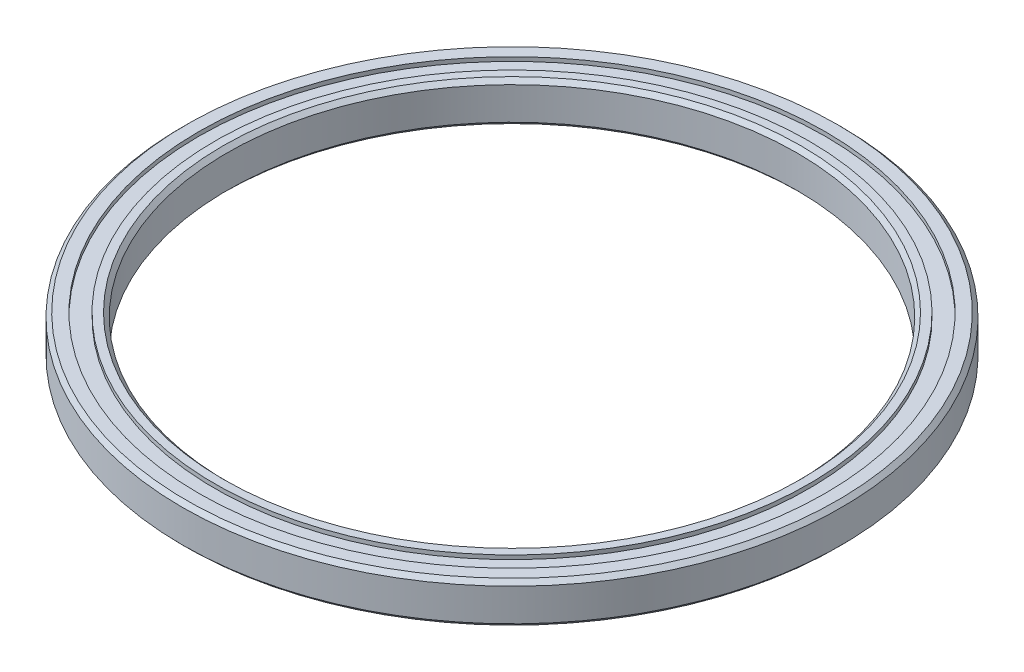
ISO-10303-21;
HEADER;
FILE_DESCRIPTION(('STEP AP214'),'2;1');
FILE_NAME('part.step','',(''),(''),'','','');
FILE_SCHEMA(('AUTOMOTIVE_DESIGN { 1 0 10303 214 1 1 1 1 }'));
ENDSEC;
DATA;
#1=APPLICATION_CONTEXT('core data for automotive mechanical design processes');
#2=APPLICATION_PROTOCOL_DEFINITION('international standard','automotive_design',2000,#1);
#3=PRODUCT_CONTEXT('',#1,'mechanical');
#4=PRODUCT('Part','Part','',(#3));
#5=PRODUCT_RELATED_PRODUCT_CATEGORY('part','',(#4));
#6=PRODUCT_DEFINITION_FORMATION('','',#4);
#7=PRODUCT_DEFINITION_CONTEXT('part definition',#1,'design');
#8=PRODUCT_DEFINITION('design','',#6,#7);
#9=PRODUCT_DEFINITION_SHAPE('','',#8);
#10=(LENGTH_UNIT() NAMED_UNIT(*) SI_UNIT(.MILLI.,.METRE.));
#11=(NAMED_UNIT(*) PLANE_ANGLE_UNIT() SI_UNIT($,.RADIAN.));
#12=(NAMED_UNIT(*) SI_UNIT($,.STERADIAN.) SOLID_ANGLE_UNIT());
#13=UNCERTAINTY_MEASURE_WITH_UNIT(LENGTH_MEASURE(1.E-05),#10,'distance_accuracy_value','');
#14=(GEOMETRIC_REPRESENTATION_CONTEXT(3) GLOBAL_UNCERTAINTY_ASSIGNED_CONTEXT((#13)) GLOBAL_UNIT_ASSIGNED_CONTEXT((#10,
#11,#12)) REPRESENTATION_CONTEXT('',''));
#15=CARTESIAN_POINT('',(0.,0.,0.));
#16=DIRECTION('',(0.,0.,1.));
#17=DIRECTION('',(1.,0.,0.));
#18=AXIS2_PLACEMENT_3D('',#15,#16,#17);
#19=CARTESIAN_POINT('',(0.,0.,0.));
#20=DIRECTION('',(0.,-1.,0.));
#21=DIRECTION('',(0.,0.,-1.));
#22=AXIS2_PLACEMENT_3D('',#19,#20,#21);
#23=CYLINDRICAL_SURFACE('',#22,38.5);
#24=CARTESIAN_POINT('',(0.,5.,0.));
#25=DIRECTION('',(0.,-1.,0.));
#26=DIRECTION('',(0.,0.,-1.));
#27=AXIS2_PLACEMENT_3D('',#24,#25,#26);
#28=CIRCLE('',#27,38.5);
#29=CARTESIAN_POINT('',(0.,5.,-38.5));
#30=VERTEX_POINT('',#29);
#31=EDGE_CURVE('E10',#30,#30,#28,.T.);
#32=ORIENTED_EDGE('',*,*,#31,.F.);
#33=EDGE_LOOP('',(#32));
#34=FACE_BOUND('',#33,.T.);
#35=CARTESIAN_POINT('',(0.,4.5,0.));
#36=DIRECTION('',(0.,-1.,0.));
#37=DIRECTION('',(0.,0.,-1.));
#38=AXIS2_PLACEMENT_3D('',#35,#36,#37);
#39=CIRCLE('',#38,38.5);
#40=CARTESIAN_POINT('',(0.,4.5,-38.5));
#41=VERTEX_POINT('',#40);
#42=EDGE_CURVE('E91',#41,#41,#39,.T.);
#43=ORIENTED_EDGE('',*,*,#42,.T.);
#44=EDGE_LOOP('',(#43));
#45=FACE_BOUND('',#44,.T.);
#46=ADVANCED_FACE('F39',(#34,#45),#23,.F.);
#47=CARTESIAN_POINT('',(-40.,5.,0.));
#48=DIRECTION('',(0.,-1.,0.));
#49=DIRECTION('',(0.,0.,-1.));
#50=AXIS2_PLACEMENT_3D('',#47,#48,#49);
#51=PLANE('',#50);
#52=CARTESIAN_POINT('',(0.,5.,0.));
#53=DIRECTION('',(0.,-1.,0.));
#54=DIRECTION('',(0.,0.,-1.));
#55=AXIS2_PLACEMENT_3D('',#52,#53,#54);
#56=CIRCLE('',#55,40.);
#57=CARTESIAN_POINT('',(0.,5.,-40.));
#58=VERTEX_POINT('',#57);
#59=EDGE_CURVE('E45',#58,#58,#56,.T.);
#60=ORIENTED_EDGE('',*,*,#59,.F.);
#61=EDGE_LOOP('',(#60));
#62=FACE_BOUND('',#61,.T.);
#63=ORIENTED_EDGE('',*,*,#31,.T.);
#64=EDGE_LOOP('',(#63));
#65=FACE_BOUND('',#64,.T.);
#66=ADVANCED_FACE('F176',(#62,#65),#51,.F.);
#67=CARTESIAN_POINT('',(0.,5.,0.));
#68=DIRECTION('',(0.,-1.,0.));
#69=DIRECTION('',(0.,0.,-1.));
#70=AXIS2_PLACEMENT_3D('',#67,#68,#69);
#71=CONICAL_SURFACE('',#70,40.,0.785398163397449);
#72=CARTESIAN_POINT('',(0.,4.5,0.));
#73=DIRECTION('',(0.,-1.,0.));
#74=DIRECTION('',(0.,0.,-1.));
#75=AXIS2_PLACEMENT_3D('',#72,#73,#74);
#76=CIRCLE('',#75,40.5);
#77=CARTESIAN_POINT('',(0.,4.5,-40.5));
#78=VERTEX_POINT('',#77);
#79=EDGE_CURVE('E49',#78,#78,#76,.T.);
#80=ORIENTED_EDGE('',*,*,#79,.F.);
#81=EDGE_LOOP('',(#80));
#82=FACE_BOUND('',#81,.T.);
#83=ORIENTED_EDGE('',*,*,#59,.T.);
#84=EDGE_LOOP('',(#83));
#85=FACE_BOUND('',#84,.T.);
#86=ADVANCED_FACE('F171',(#82,#85),#71,.T.);
#87=CARTESIAN_POINT('',(0.,0.,0.));
#88=DIRECTION('',(0.,-1.,0.));
#89=DIRECTION('',(0.,0.,-1.));
#90=AXIS2_PLACEMENT_3D('',#87,#88,#89);
#91=CYLINDRICAL_SURFACE('',#90,40.5);
#92=CARTESIAN_POINT('',(0.,0.499999999999999,0.));
#93=DIRECTION('',(0.,-1.,0.));
#94=DIRECTION('',(0.,0.,-1.));
#95=AXIS2_PLACEMENT_3D('',#92,#93,#94);
#96=CIRCLE('',#95,40.5);
#97=CARTESIAN_POINT('',(0.,0.499999999999999,-40.5));
#98=VERTEX_POINT('',#97);
#99=EDGE_CURVE('E53',#98,#98,#96,.T.);
#100=ORIENTED_EDGE('',*,*,#99,.F.);
#101=EDGE_LOOP('',(#100));
#102=FACE_BOUND('',#101,.T.);
#103=ORIENTED_EDGE('',*,*,#79,.T.);
#104=EDGE_LOOP('',(#103));
#105=FACE_BOUND('',#104,.T.);
#106=ADVANCED_FACE('F165',(#102,#105),#91,.T.);
#107=CARTESIAN_POINT('',(0.,0.499999999999999,0.));
#108=DIRECTION('',(0.,1.,0.));
#109=DIRECTION('',(0.,0.,1.));
#110=AXIS2_PLACEMENT_3D('',#107,#108,#109);
#111=CONICAL_SURFACE('',#110,40.5,0.785398163397449);
#112=CARTESIAN_POINT('',(0.,0.,0.));
#113=DIRECTION('',(0.,-1.,0.));
#114=DIRECTION('',(0.,0.,-1.));
#115=AXIS2_PLACEMENT_3D('',#112,#113,#114);
#116=CIRCLE('',#115,40.);
#117=CARTESIAN_POINT('',(0.,0.,-40.));
#118=VERTEX_POINT('',#117);
#119=EDGE_CURVE('E58',#118,#118,#116,.T.);
#120=ORIENTED_EDGE('',*,*,#119,.F.);
#121=EDGE_LOOP('',(#120));
#122=FACE_BOUND('',#121,.T.);
#123=ORIENTED_EDGE('',*,*,#99,.T.);
#124=EDGE_LOOP('',(#123));
#125=FACE_BOUND('',#124,.T.);
#126=ADVANCED_FACE('F159',(#122,#125),#111,.T.);
#127=CARTESIAN_POINT('',(-38.5,0.,0.));
#128=DIRECTION('',(0.,1.,0.));
#129=DIRECTION('',(0.,0.,1.));
#130=AXIS2_PLACEMENT_3D('',#127,#128,#129);
#131=PLANE('',#130);
#132=CARTESIAN_POINT('',(0.,0.,0.));
#133=DIRECTION('',(0.,-1.,0.));
#134=DIRECTION('',(0.,0.,-1.));
#135=AXIS2_PLACEMENT_3D('',#132,#133,#134);
#136=CIRCLE('',#135,38.5);
#137=CARTESIAN_POINT('',(0.,0.,-38.5));
#138=VERTEX_POINT('',#137);
#139=EDGE_CURVE('E61',#138,#138,#136,.T.);
#140=ORIENTED_EDGE('',*,*,#139,.F.);
#141=EDGE_LOOP('',(#140));
#142=FACE_BOUND('',#141,.T.);
#143=ORIENTED_EDGE('',*,*,#119,.T.);
#144=EDGE_LOOP('',(#143));
#145=FACE_BOUND('',#144,.T.);
#146=ADVANCED_FACE('F153',(#142,#145),#131,.F.);
#147=CARTESIAN_POINT('',(0.,0.,0.));
#148=DIRECTION('',(0.,-1.,0.));
#149=DIRECTION('',(0.,0.,-1.));
#150=AXIS2_PLACEMENT_3D('',#147,#148,#149);
#151=CYLINDRICAL_SURFACE('',#150,38.5);
#152=CARTESIAN_POINT('',(0.,0.499999999999995,0.));
#153=DIRECTION('',(0.,-1.,0.));
#154=DIRECTION('',(0.,0.,-1.));
#155=AXIS2_PLACEMENT_3D('',#152,#153,#154);
#156=CIRCLE('',#155,38.5);
#157=CARTESIAN_POINT('',(0.,0.499999999999995,-38.5));
#158=VERTEX_POINT('',#157);
#159=EDGE_CURVE('E64',#158,#158,#156,.T.);
#160=ORIENTED_EDGE('',*,*,#159,.F.);
#161=EDGE_LOOP('',(#160));
#162=FACE_BOUND('',#161,.T.);
#163=ORIENTED_EDGE('',*,*,#139,.T.);
#164=EDGE_LOOP('',(#163));
#165=FACE_BOUND('',#164,.T.);
#166=ADVANCED_FACE('F147',(#162,#165),#151,.F.);
#167=CARTESIAN_POINT('',(-38.5,0.499999999999995,0.));
#168=DIRECTION('',(0.,1.,0.));
#169=DIRECTION('',(0.,0.,1.));
#170=AXIS2_PLACEMENT_3D('',#167,#168,#169);
#171=PLANE('',#170);
#172=CARTESIAN_POINT('',(0.,0.499999999999995,0.));
#173=DIRECTION('',(0.,-1.,0.));
#174=DIRECTION('',(0.,0.,-1.));
#175=AXIS2_PLACEMENT_3D('',#172,#173,#174);
#176=CIRCLE('',#175,36.5);
#177=CARTESIAN_POINT('',(0.,0.499999999999995,-36.5));
#178=VERTEX_POINT('',#177);
#179=EDGE_CURVE('E67',#178,#178,#176,.T.);
#180=ORIENTED_EDGE('',*,*,#179,.F.);
#181=EDGE_LOOP('',(#180));
#182=FACE_BOUND('',#181,.T.);
#183=ORIENTED_EDGE('',*,*,#159,.T.);
#184=EDGE_LOOP('',(#183));
#185=FACE_BOUND('',#184,.T.);
#186=ADVANCED_FACE('F141',(#182,#185),#171,.F.);
#187=CARTESIAN_POINT('',(0.,0.,0.));
#188=DIRECTION('',(0.,-1.,0.));
#189=DIRECTION('',(0.,0.,-1.));
#190=AXIS2_PLACEMENT_3D('',#187,#188,#189);
#191=CYLINDRICAL_SURFACE('',#190,36.5);
#192=CARTESIAN_POINT('',(0.,0.,0.));
#193=DIRECTION('',(0.,-1.,0.));
#194=DIRECTION('',(0.,0.,-1.));
#195=AXIS2_PLACEMENT_3D('',#192,#193,#194);
#196=CIRCLE('',#195,36.5);
#197=CARTESIAN_POINT('',(0.,0.,-36.5));
#198=VERTEX_POINT('',#197);
#199=EDGE_CURVE('E70',#198,#198,#196,.T.);
#200=ORIENTED_EDGE('',*,*,#199,.F.);
#201=EDGE_LOOP('',(#200));
#202=FACE_BOUND('',#201,.T.);
#203=ORIENTED_EDGE('',*,*,#179,.T.);
#204=EDGE_LOOP('',(#203));
#205=FACE_BOUND('',#204,.T.);
#206=ADVANCED_FACE('F135',(#202,#205),#191,.T.);
#207=CARTESIAN_POINT('',(-35.5,0.,0.));
#208=DIRECTION('',(0.,1.,0.));
#209=DIRECTION('',(0.,0.,1.));
#210=AXIS2_PLACEMENT_3D('',#207,#208,#209);
#211=PLANE('',#210);
#212=CARTESIAN_POINT('',(0.,0.,0.));
#213=DIRECTION('',(0.,-1.,0.));
#214=DIRECTION('',(0.,0.,-1.));
#215=AXIS2_PLACEMENT_3D('',#212,#213,#214);
#216=CIRCLE('',#215,35.5);
#217=CARTESIAN_POINT('',(0.,0.,-35.5));
#218=VERTEX_POINT('',#217);
#219=EDGE_CURVE('E73',#218,#218,#216,.T.);
#220=ORIENTED_EDGE('',*,*,#219,.F.);
#221=EDGE_LOOP('',(#220));
#222=FACE_BOUND('',#221,.T.);
#223=ORIENTED_EDGE('',*,*,#199,.T.);
#224=EDGE_LOOP('',(#223));
#225=FACE_BOUND('',#224,.T.);
#226=ADVANCED_FACE('F129',(#222,#225),#211,.F.);
#227=CARTESIAN_POINT('',(0.,0.,0.));
#228=DIRECTION('',(0.,-1.,0.));
#229=DIRECTION('',(0.,0.,-1.));
#230=AXIS2_PLACEMENT_3D('',#227,#228,#229);
#231=CONICAL_SURFACE('',#230,35.5,0.785398163397452);
#232=CARTESIAN_POINT('',(0.,0.499999999999998,0.));
#233=DIRECTION('',(0.,-1.,0.));
#234=DIRECTION('',(0.,0.,-1.));
#235=AXIS2_PLACEMENT_3D('',#232,#233,#234);
#236=CIRCLE('',#235,35.);
#237=CARTESIAN_POINT('',(0.,0.499999999999998,-35.));
#238=VERTEX_POINT('',#237);
#239=EDGE_CURVE('E76',#238,#238,#236,.T.);
#240=ORIENTED_EDGE('',*,*,#239,.F.);
#241=EDGE_LOOP('',(#240));
#242=FACE_BOUND('',#241,.T.);
#243=ORIENTED_EDGE('',*,*,#219,.T.);
#244=EDGE_LOOP('',(#243));
#245=FACE_BOUND('',#244,.T.);
#246=ADVANCED_FACE('F123',(#242,#245),#231,.F.);
#247=CARTESIAN_POINT('',(0.,0.,0.));
#248=DIRECTION('',(0.,-1.,0.));
#249=DIRECTION('',(0.,0.,-1.));
#250=AXIS2_PLACEMENT_3D('',#247,#248,#249);
#251=CYLINDRICAL_SURFACE('',#250,35.);
#252=CARTESIAN_POINT('',(0.,4.5,0.));
#253=DIRECTION('',(0.,-1.,0.));
#254=DIRECTION('',(0.,0.,-1.));
#255=AXIS2_PLACEMENT_3D('',#252,#253,#254);
#256=CIRCLE('',#255,35.);
#257=CARTESIAN_POINT('',(0.,4.5,-35.));
#258=VERTEX_POINT('',#257);
#259=EDGE_CURVE('E79',#258,#258,#256,.T.);
#260=ORIENTED_EDGE('',*,*,#259,.F.);
#261=EDGE_LOOP('',(#260));
#262=FACE_BOUND('',#261,.T.);
#263=ORIENTED_EDGE('',*,*,#239,.T.);
#264=EDGE_LOOP('',(#263));
#265=FACE_BOUND('',#264,.T.);
#266=ADVANCED_FACE('F117',(#262,#265),#251,.F.);
#267=CARTESIAN_POINT('',(0.,4.5,0.));
#268=DIRECTION('',(0.,1.,0.));
#269=DIRECTION('',(0.,0.,1.));
#270=AXIS2_PLACEMENT_3D('',#267,#268,#269);
#271=CONICAL_SURFACE('',#270,35.,0.785398163397445);
#272=CARTESIAN_POINT('',(0.,5.,0.));
#273=DIRECTION('',(0.,-1.,0.));
#274=DIRECTION('',(0.,0.,-1.));
#275=AXIS2_PLACEMENT_3D('',#272,#273,#274);
#276=CIRCLE('',#275,35.5);
#277=CARTESIAN_POINT('',(0.,5.,-35.5));
#278=VERTEX_POINT('',#277);
#279=EDGE_CURVE('E82',#278,#278,#276,.T.);
#280=ORIENTED_EDGE('',*,*,#279,.F.);
#281=EDGE_LOOP('',(#280));
#282=FACE_BOUND('',#281,.T.);
#283=ORIENTED_EDGE('',*,*,#259,.T.);
#284=EDGE_LOOP('',(#283));
#285=FACE_BOUND('',#284,.T.);
#286=ADVANCED_FACE('F111',(#282,#285),#271,.F.);
#287=CARTESIAN_POINT('',(-36.5,5.,0.));
#288=DIRECTION('',(0.,-1.,0.));
#289=DIRECTION('',(0.,0.,-1.));
#290=AXIS2_PLACEMENT_3D('',#287,#288,#289);
#291=PLANE('',#290);
#292=CARTESIAN_POINT('',(0.,5.,0.));
#293=DIRECTION('',(0.,-1.,0.));
#294=DIRECTION('',(0.,0.,-1.));
#295=AXIS2_PLACEMENT_3D('',#292,#293,#294);
#296=CIRCLE('',#295,36.5);
#297=CARTESIAN_POINT('',(0.,5.,-36.5));
#298=VERTEX_POINT('',#297);
#299=EDGE_CURVE('E85',#298,#298,#296,.T.);
#300=ORIENTED_EDGE('',*,*,#299,.F.);
#301=EDGE_LOOP('',(#300));
#302=FACE_BOUND('',#301,.T.);
#303=ORIENTED_EDGE('',*,*,#279,.T.);
#304=EDGE_LOOP('',(#303));
#305=FACE_BOUND('',#304,.T.);
#306=ADVANCED_FACE('F105',(#302,#305),#291,.F.);
#307=CARTESIAN_POINT('',(0.,0.,0.));
#308=DIRECTION('',(0.,-1.,0.));
#309=DIRECTION('',(0.,0.,-1.));
#310=AXIS2_PLACEMENT_3D('',#307,#308,#309);
#311=CYLINDRICAL_SURFACE('',#310,36.5);
#312=CARTESIAN_POINT('',(0.,4.5,0.));
#313=DIRECTION('',(0.,-1.,0.));
#314=DIRECTION('',(0.,0.,-1.));
#315=AXIS2_PLACEMENT_3D('',#312,#313,#314);
#316=CIRCLE('',#315,36.5);
#317=CARTESIAN_POINT('',(0.,4.5,-36.5));
#318=VERTEX_POINT('',#317);
#319=EDGE_CURVE('E88',#318,#318,#316,.T.);
#320=ORIENTED_EDGE('',*,*,#319,.F.);
#321=EDGE_LOOP('',(#320));
#322=FACE_BOUND('',#321,.T.);
#323=ORIENTED_EDGE('',*,*,#299,.T.);
#324=EDGE_LOOP('',(#323));
#325=FACE_BOUND('',#324,.T.);
#326=ADVANCED_FACE('F99',(#322,#325),#311,.T.);
#327=CARTESIAN_POINT('',(-38.5,4.5,0.));
#328=DIRECTION('',(0.,-1.,0.));
#329=DIRECTION('',(0.,0.,-1.));
#330=AXIS2_PLACEMENT_3D('',#327,#328,#329);
#331=PLANE('',#330);
#332=ORIENTED_EDGE('',*,*,#42,.F.);
#333=EDGE_LOOP('',(#332));
#334=FACE_BOUND('',#333,.T.);
#335=ORIENTED_EDGE('',*,*,#319,.T.);
#336=EDGE_LOOP('',(#335));
#337=FACE_BOUND('',#336,.T.);
#338=ADVANCED_FACE('F96',(#334,#337),#331,.F.);
#339=CLOSED_SHELL('',(#46,#66,#86,#106,#126,#146,#166,#186,#206,#226,#246,#266,#286,#306,#326,#338));
#340=MANIFOLD_SOLID_BREP('B2',#339);
#341=ADVANCED_BREP_SHAPE_REPRESENTATION('',(#18,#340),#14);
#342=SHAPE_DEFINITION_REPRESENTATION(#9,#341);
ENDSEC;
END-ISO-10303-21;
